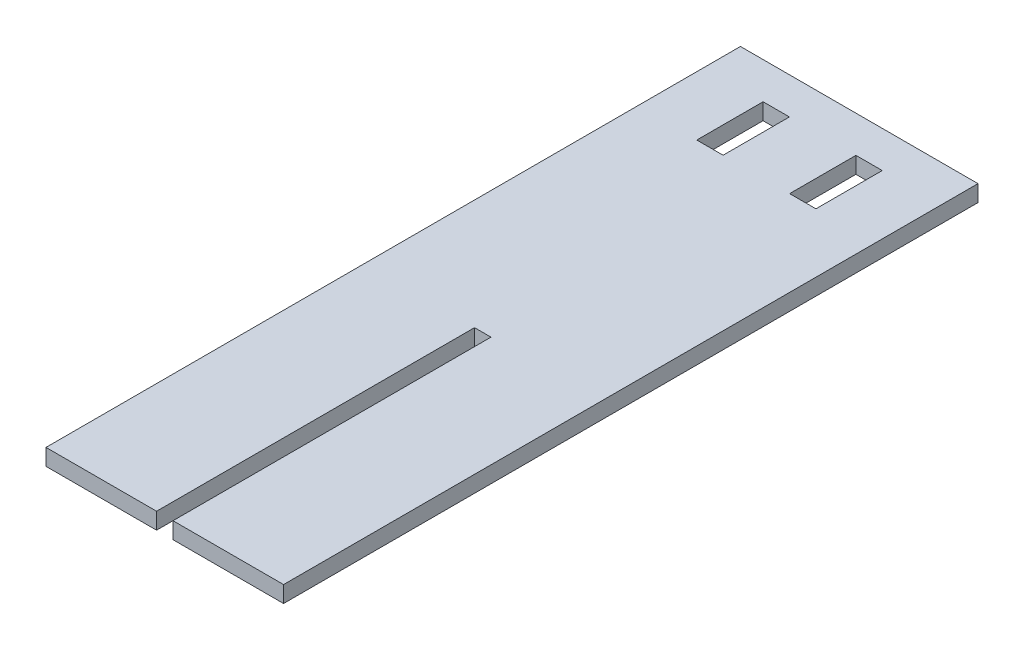
ISO-10303-21;
HEADER;
FILE_DESCRIPTION(('STEP AP214'),'2;1');
FILE_NAME('part.step','',(''),(''),'','','');
FILE_SCHEMA(('AUTOMOTIVE_DESIGN { 1 0 10303 214 1 1 1 1 }'));
ENDSEC;
DATA;
#1=APPLICATION_CONTEXT('core data for automotive mechanical design processes');
#2=APPLICATION_PROTOCOL_DEFINITION('international standard','automotive_design',2000,#1);
#3=PRODUCT_CONTEXT('',#1,'mechanical');
#4=PRODUCT('Part','Part','',(#3));
#5=PRODUCT_RELATED_PRODUCT_CATEGORY('part','',(#4));
#6=PRODUCT_DEFINITION_FORMATION('','',#4);
#7=PRODUCT_DEFINITION_CONTEXT('part definition',#1,'design');
#8=PRODUCT_DEFINITION('design','',#6,#7);
#9=PRODUCT_DEFINITION_SHAPE('','',#8);
#10=(LENGTH_UNIT() NAMED_UNIT(*) SI_UNIT(.MILLI.,.METRE.));
#11=(NAMED_UNIT(*) PLANE_ANGLE_UNIT() SI_UNIT($,.RADIAN.));
#12=(NAMED_UNIT(*) SI_UNIT($,.STERADIAN.) SOLID_ANGLE_UNIT());
#13=UNCERTAINTY_MEASURE_WITH_UNIT(LENGTH_MEASURE(1.E-05),#10,'distance_accuracy_value','');
#14=(GEOMETRIC_REPRESENTATION_CONTEXT(3) GLOBAL_UNCERTAINTY_ASSIGNED_CONTEXT((#13)) GLOBAL_UNIT_ASSIGNED_CONTEXT((#10,
#11,#12)) REPRESENTATION_CONTEXT('',''));
#15=CARTESIAN_POINT('',(0.,0.,0.));
#16=DIRECTION('',(0.,0.,1.));
#17=DIRECTION('',(1.,0.,0.));
#18=AXIS2_PLACEMENT_3D('',#15,#16,#17);
#19=CARTESIAN_POINT('',(-157.233042697884,5.715,-228.599999999999));
#20=DIRECTION('',(0.,0.,1.));
#21=DIRECTION('',(1.,0.,0.));
#22=AXIS2_PLACEMENT_3D('',#19,#20,#21);
#23=PLANE('',#22);
#24=DIRECTION('',(-1.,0.,0.));
#25=VECTOR('',#24,1.);
#26=CARTESIAN_POINT('',(-157.233042697884,0.,-228.599999999999));
#27=LINE('',#26,#25);
#28=CARTESIAN_POINT('',(29.718,0.,-228.6));
#29=VERTEX_POINT('',#28);
#30=CARTESIAN_POINT('',(20.574,0.,-228.6));
#31=VERTEX_POINT('',#30);
#32=EDGE_CURVE('E251',#29,#31,#27,.T.);
#33=ORIENTED_EDGE('',*,*,#32,.F.);
#34=DIRECTION('',(0.,-1.,0.));
#35=VECTOR('',#34,1.);
#36=CARTESIAN_POINT('',(29.718,5.715,-228.6));
#37=LINE('',#36,#35);
#38=CARTESIAN_POINT('',(29.718,5.715,-228.6));
#39=VERTEX_POINT('',#38);
#40=EDGE_CURVE('E11',#39,#29,#37,.T.);
#41=ORIENTED_EDGE('',*,*,#40,.F.);
#42=DIRECTION('',(-1.,0.,0.));
#43=VECTOR('',#42,1.);
#44=CARTESIAN_POINT('',(-157.233042697884,5.715,-228.599999999999));
#45=LINE('',#44,#43);
#46=CARTESIAN_POINT('',(20.574,5.715,-228.6));
#47=VERTEX_POINT('',#46);
#48=EDGE_CURVE('E168',#39,#47,#45,.T.);
#49=ORIENTED_EDGE('',*,*,#48,.T.);
#50=DIRECTION('',(0.,-1.,0.));
#51=VECTOR('',#50,1.);
#52=CARTESIAN_POINT('',(20.574,5.715,-228.6));
#53=LINE('',#52,#51);
#54=EDGE_CURVE('E54',#47,#31,#53,.T.);
#55=ORIENTED_EDGE('',*,*,#54,.T.);
#56=EDGE_LOOP('',(#33,#41,#49,#55));
#57=FACE_BOUND('',#56,.T.);
#58=ADVANCED_FACE('F35',(#57),#23,.T.);
#59=CARTESIAN_POINT('',(29.718,5.715,-120.65));
#60=DIRECTION('',(1.,0.,0.));
#61=DIRECTION('',(0.,0.,-1.));
#62=AXIS2_PLACEMENT_3D('',#59,#60,#61);
#63=PLANE('',#62);
#64=DIRECTION('',(0.,0.,1.));
#65=VECTOR('',#64,1.);
#66=CARTESIAN_POINT('',(29.718,0.,-120.65));
#67=LINE('',#66,#65);
#68=CARTESIAN_POINT('',(29.718,0.,-205.5622));
#69=VERTEX_POINT('',#68);
#70=EDGE_CURVE('E173',#29,#69,#67,.T.);
#71=ORIENTED_EDGE('',*,*,#70,.T.);
#72=DIRECTION('',(0.,-1.,0.));
#73=VECTOR('',#72,1.);
#74=CARTESIAN_POINT('',(29.718,5.715,-205.5622));
#75=LINE('',#74,#73);
#76=CARTESIAN_POINT('',(29.718,5.715,-205.5622));
#77=VERTEX_POINT('',#76);
#78=EDGE_CURVE('E45',#77,#69,#75,.T.);
#79=ORIENTED_EDGE('',*,*,#78,.F.);
#80=DIRECTION('',(0.,0.,1.));
#81=VECTOR('',#80,1.);
#82=CARTESIAN_POINT('',(29.718,5.715,-120.65));
#83=LINE('',#82,#81);
#84=EDGE_CURVE('E163',#39,#77,#83,.T.);
#85=ORIENTED_EDGE('',*,*,#84,.F.);
#86=ORIENTED_EDGE('',*,*,#40,.T.);
#87=EDGE_LOOP('',(#71,#79,#85,#86));
#88=FACE_BOUND('',#87,.T.);
#89=ADVANCED_FACE('F171',(#88),#63,.F.);
#90=CARTESIAN_POINT('',(-157.233042697883,5.715,-205.5622));
#91=DIRECTION('',(0.,0.,1.));
#92=DIRECTION('',(1.,0.,0.));
#93=AXIS2_PLACEMENT_3D('',#90,#91,#92);
#94=PLANE('',#93);
#95=DIRECTION('',(-1.,0.,0.));
#96=VECTOR('',#95,1.);
#97=CARTESIAN_POINT('',(-157.233042697883,0.,-205.5622));
#98=LINE('',#97,#96);
#99=CARTESIAN_POINT('',(20.574,0.,-205.5622));
#100=VERTEX_POINT('',#99);
#101=EDGE_CURVE('E254',#69,#100,#98,.T.);
#102=ORIENTED_EDGE('',*,*,#101,.T.);
#103=DIRECTION('',(0.,-1.,0.));
#104=VECTOR('',#103,1.);
#105=CARTESIAN_POINT('',(20.574,5.715,-205.5622));
#106=LINE('',#105,#104);
#107=CARTESIAN_POINT('',(20.574,5.715,-205.5622));
#108=VERTEX_POINT('',#107);
#109=EDGE_CURVE('E104',#108,#100,#106,.T.);
#110=ORIENTED_EDGE('',*,*,#109,.F.);
#111=DIRECTION('',(-1.,0.,0.));
#112=VECTOR('',#111,1.);
#113=CARTESIAN_POINT('',(-157.233042697883,5.715,-205.5622));
#114=LINE('',#113,#112);
#115=EDGE_CURVE('E155',#77,#108,#114,.T.);
#116=ORIENTED_EDGE('',*,*,#115,.F.);
#117=ORIENTED_EDGE('',*,*,#78,.T.);
#118=EDGE_LOOP('',(#102,#110,#116,#117));
#119=FACE_BOUND('',#118,.T.);
#120=ADVANCED_FACE('F157',(#119),#94,.F.);
#121=CARTESIAN_POINT('',(-157.233042697883,5.715,-228.600000000001));
#122=DIRECTION('',(0.,0.,-1.));
#123=DIRECTION('',(-1.,0.,0.));
#124=AXIS2_PLACEMENT_3D('',#121,#122,#123);
#125=PLANE('',#124);
#126=DIRECTION('',(1.,0.,0.));
#127=VECTOR('',#126,1.);
#128=CARTESIAN_POINT('',(-157.233042697883,0.,-228.600000000001));
#129=LINE('',#128,#127);
#130=CARTESIAN_POINT('',(52.832,0.,-228.6));
#131=VERTEX_POINT('',#130);
#132=CARTESIAN_POINT('',(61.976,0.,-228.6));
#133=VERTEX_POINT('',#132);
#134=EDGE_CURVE('E239',#131,#133,#129,.T.);
#135=ORIENTED_EDGE('',*,*,#134,.T.);
#136=DIRECTION('',(0.,-1.,0.));
#137=VECTOR('',#136,1.);
#138=CARTESIAN_POINT('',(61.976,5.715,-228.6));
#139=LINE('',#138,#137);
#140=CARTESIAN_POINT('',(61.976,5.715,-228.6));
#141=VERTEX_POINT('',#140);
#142=EDGE_CURVE('E184',#141,#133,#139,.T.);
#143=ORIENTED_EDGE('',*,*,#142,.F.);
#144=DIRECTION('',(1.,0.,0.));
#145=VECTOR('',#144,1.);
#146=CARTESIAN_POINT('',(-157.233042697883,5.715,-228.600000000001));
#147=LINE('',#146,#145);
#148=CARTESIAN_POINT('',(52.832,5.715,-228.6));
#149=VERTEX_POINT('',#148);
#150=EDGE_CURVE('E276',#149,#141,#147,.T.);
#151=ORIENTED_EDGE('',*,*,#150,.F.);
#152=DIRECTION('',(0.,-1.,0.));
#153=VECTOR('',#152,1.);
#154=CARTESIAN_POINT('',(52.832,5.715,-228.6));
#155=LINE('',#154,#153);
#156=EDGE_CURVE('E178',#149,#131,#155,.T.);
#157=ORIENTED_EDGE('',*,*,#156,.T.);
#158=EDGE_LOOP('',(#135,#143,#151,#157));
#159=FACE_BOUND('',#158,.T.);
#160=ADVANCED_FACE('F320',(#159),#125,.F.);
#161=CARTESIAN_POINT('',(61.976,5.715,-120.65));
#162=DIRECTION('',(1.,0.,0.));
#163=DIRECTION('',(0.,0.,-1.));
#164=AXIS2_PLACEMENT_3D('',#161,#162,#163);
#165=PLANE('',#164);
#166=DIRECTION('',(0.,0.,1.));
#167=VECTOR('',#166,1.);
#168=CARTESIAN_POINT('',(61.976,0.,-120.65));
#169=LINE('',#168,#167);
#170=CARTESIAN_POINT('',(61.976,0.,-205.5622));
#171=VERTEX_POINT('',#170);
#172=EDGE_CURVE('E242',#133,#171,#169,.T.);
#173=ORIENTED_EDGE('',*,*,#172,.T.);
#174=DIRECTION('',(0.,-1.,0.));
#175=VECTOR('',#174,1.);
#176=CARTESIAN_POINT('',(61.976,5.715,-205.5622));
#177=LINE('',#176,#175);
#178=CARTESIAN_POINT('',(61.976,5.715,-205.5622));
#179=VERTEX_POINT('',#178);
#180=EDGE_CURVE('E182',#179,#171,#177,.T.);
#181=ORIENTED_EDGE('',*,*,#180,.F.);
#182=DIRECTION('',(0.,0.,1.));
#183=VECTOR('',#182,1.);
#184=CARTESIAN_POINT('',(61.976,5.715,-120.65));
#185=LINE('',#184,#183);
#186=EDGE_CURVE('E279',#141,#179,#185,.T.);
#187=ORIENTED_EDGE('',*,*,#186,.F.);
#188=ORIENTED_EDGE('',*,*,#142,.T.);
#189=EDGE_LOOP('',(#173,#181,#187,#188));
#190=FACE_BOUND('',#189,.T.);
#191=ADVANCED_FACE('F316',(#190),#165,.F.);
#192=CARTESIAN_POINT('',(-157.233042697883,5.715,-205.5622));
#193=DIRECTION('',(0.,0.,-1.));
#194=DIRECTION('',(-1.,0.,0.));
#195=AXIS2_PLACEMENT_3D('',#192,#193,#194);
#196=PLANE('',#195);
#197=DIRECTION('',(1.,0.,0.));
#198=VECTOR('',#197,1.);
#199=CARTESIAN_POINT('',(-157.233042697883,0.,-205.5622));
#200=LINE('',#199,#198);
#201=CARTESIAN_POINT('',(52.832,0.,-205.5622));
#202=VERTEX_POINT('',#201);
#203=EDGE_CURVE('E245',#202,#171,#200,.T.);
#204=ORIENTED_EDGE('',*,*,#203,.F.);
#205=DIRECTION('',(0.,-1.,0.));
#206=VECTOR('',#205,1.);
#207=CARTESIAN_POINT('',(52.832,5.715,-205.5622));
#208=LINE('',#207,#206);
#209=CARTESIAN_POINT('',(52.832,5.715,-205.5622));
#210=VERTEX_POINT('',#209);
#211=EDGE_CURVE('E180',#210,#202,#208,.T.);
#212=ORIENTED_EDGE('',*,*,#211,.F.);
#213=DIRECTION('',(1.,0.,0.));
#214=VECTOR('',#213,1.);
#215=CARTESIAN_POINT('',(-157.233042697883,5.715,-205.5622));
#216=LINE('',#215,#214);
#217=EDGE_CURVE('E281',#210,#179,#216,.T.);
#218=ORIENTED_EDGE('',*,*,#217,.T.);
#219=ORIENTED_EDGE('',*,*,#180,.T.);
#220=EDGE_LOOP('',(#204,#212,#218,#219));
#221=FACE_BOUND('',#220,.T.);
#222=ADVANCED_FACE('F313',(#221),#196,.T.);
#223=CARTESIAN_POINT('',(-157.233042697883,5.715,-241.3));
#224=DIRECTION('',(0.,0.,-1.));
#225=DIRECTION('',(-1.,0.,0.));
#226=AXIS2_PLACEMENT_3D('',#223,#224,#225);
#227=PLANE('',#226);
#228=DIRECTION('',(1.,0.,0.));
#229=VECTOR('',#228,1.);
#230=CARTESIAN_POINT('',(-157.233042697883,0.,-241.3));
#231=LINE('',#230,#229);
#232=CARTESIAN_POINT('',(0.,0.,-241.3));
#233=VERTEX_POINT('',#232);
#234=CARTESIAN_POINT('',(82.55,0.,-241.3));
#235=VERTEX_POINT('',#234);
#236=EDGE_CURVE('E215',#233,#235,#231,.T.);
#237=ORIENTED_EDGE('',*,*,#236,.F.);
#238=DIRECTION('',(0.,-1.,0.));
#239=VECTOR('',#238,1.);
#240=CARTESIAN_POINT('',(0.,5.715,-241.3));
#241=LINE('',#240,#239);
#242=CARTESIAN_POINT('',(0.,5.715,-241.3));
#243=VERTEX_POINT('',#242);
#244=EDGE_CURVE('E39',#243,#233,#241,.T.);
#245=ORIENTED_EDGE('',*,*,#244,.F.);
#246=DIRECTION('',(1.,0.,0.));
#247=VECTOR('',#246,1.);
#248=CARTESIAN_POINT('',(-157.233042697883,5.715,-241.3));
#249=LINE('',#248,#247);
#250=CARTESIAN_POINT('',(82.55,5.715,-241.3));
#251=VERTEX_POINT('',#250);
#252=EDGE_CURVE('E258',#243,#251,#249,.T.);
#253=ORIENTED_EDGE('',*,*,#252,.T.);
#254=DIRECTION('',(0.,-1.,0.));
#255=VECTOR('',#254,1.);
#256=CARTESIAN_POINT('',(82.55,5.715,-241.3));
#257=LINE('',#256,#255);
#258=EDGE_CURVE('E187',#251,#235,#257,.T.);
#259=ORIENTED_EDGE('',*,*,#258,.T.);
#260=EDGE_LOOP('',(#237,#245,#253,#259));
#261=FACE_BOUND('',#260,.T.);
#262=ADVANCED_FACE('F37',(#261),#227,.T.);
#263=CARTESIAN_POINT('',(0.,5.715,-120.65));
#264=DIRECTION('',(-1.,0.,0.));
#265=DIRECTION('',(0.,0.,1.));
#266=AXIS2_PLACEMENT_3D('',#263,#264,#265);
#267=PLANE('',#266);
#268=DIRECTION('',(0.,0.,-1.));
#269=VECTOR('',#268,1.);
#270=CARTESIAN_POINT('',(0.,0.,-120.65));
#271=LINE('',#270,#269);
#272=CARTESIAN_POINT('',(0.,0.,0.));
#273=VERTEX_POINT('',#272);
#274=EDGE_CURVE('E211',#273,#233,#271,.T.);
#275=ORIENTED_EDGE('',*,*,#274,.F.);
#276=DIRECTION('',(0.,-1.,0.));
#277=VECTOR('',#276,1.);
#278=CARTESIAN_POINT('',(0.,5.715,0.));
#279=LINE('',#278,#277);
#280=CARTESIAN_POINT('',(0.,5.715,0.));
#281=VERTEX_POINT('',#280);
#282=EDGE_CURVE('E201',#281,#273,#279,.T.);
#283=ORIENTED_EDGE('',*,*,#282,.F.);
#284=DIRECTION('',(0.,0.,-1.));
#285=VECTOR('',#284,1.);
#286=CARTESIAN_POINT('',(0.,5.715,-120.65));
#287=LINE('',#286,#285);
#288=EDGE_CURVE('E213',#281,#243,#287,.T.);
#289=ORIENTED_EDGE('',*,*,#288,.T.);
#290=ORIENTED_EDGE('',*,*,#244,.T.);
#291=EDGE_LOOP('',(#275,#283,#289,#290));
#292=FACE_BOUND('',#291,.T.);
#293=ADVANCED_FACE('F209',(#292),#267,.T.);
#294=CARTESIAN_POINT('',(-157.233042697883,5.715,0.));
#295=DIRECTION('',(0.,0.,-1.));
#296=DIRECTION('',(-1.,0.,0.));
#297=AXIS2_PLACEMENT_3D('',#294,#295,#296);
#298=PLANE('',#297);
#299=DIRECTION('',(1.,0.,0.));
#300=VECTOR('',#299,1.);
#301=CARTESIAN_POINT('',(-157.233042697883,0.,0.));
#302=LINE('',#301,#300);
#303=CARTESIAN_POINT('',(38.4175,0.,0.));
#304=VERTEX_POINT('',#303);
#305=EDGE_CURVE('E224',#273,#304,#302,.T.);
#306=ORIENTED_EDGE('',*,*,#305,.T.);
#307=DIRECTION('',(0.,-1.,0.));
#308=VECTOR('',#307,1.);
#309=CARTESIAN_POINT('',(38.4175,5.715,0.));
#310=LINE('',#309,#308);
#311=CARTESIAN_POINT('',(38.4175,5.715,0.));
#312=VERTEX_POINT('',#311);
#313=EDGE_CURVE('E200',#312,#304,#310,.T.);
#314=ORIENTED_EDGE('',*,*,#313,.F.);
#315=DIRECTION('',(1.,0.,0.));
#316=VECTOR('',#315,1.);
#317=CARTESIAN_POINT('',(-157.233042697883,5.715,0.));
#318=LINE('',#317,#316);
#319=EDGE_CURVE('E261',#281,#312,#318,.T.);
#320=ORIENTED_EDGE('',*,*,#319,.F.);
#321=ORIENTED_EDGE('',*,*,#282,.T.);
#322=EDGE_LOOP('',(#306,#314,#320,#321));
#323=FACE_BOUND('',#322,.T.);
#324=ADVANCED_FACE('F339',(#323),#298,.F.);
#325=CARTESIAN_POINT('',(38.4175,5.715,-120.65));
#326=DIRECTION('',(1.,0.,0.));
#327=DIRECTION('',(0.,0.,-1.));
#328=AXIS2_PLACEMENT_3D('',#325,#326,#327);
#329=PLANE('',#328);
#330=DIRECTION('',(0.,0.,1.));
#331=VECTOR('',#330,1.);
#332=CARTESIAN_POINT('',(38.4175,0.,-120.65));
#333=LINE('',#332,#331);
#334=CARTESIAN_POINT('',(38.4175,0.,-110.49));
#335=VERTEX_POINT('',#334);
#336=EDGE_CURVE('E226',#335,#304,#333,.T.);
#337=ORIENTED_EDGE('',*,*,#336,.F.);
#338=DIRECTION('',(0.,-1.,0.));
#339=VECTOR('',#338,1.);
#340=CARTESIAN_POINT('',(38.4175,5.715,-110.49));
#341=LINE('',#340,#339);
#342=CARTESIAN_POINT('',(38.4175,5.715,-110.49));
#343=VERTEX_POINT('',#342);
#344=EDGE_CURVE('E198',#343,#335,#341,.T.);
#345=ORIENTED_EDGE('',*,*,#344,.F.);
#346=DIRECTION('',(0.,0.,1.));
#347=VECTOR('',#346,1.);
#348=CARTESIAN_POINT('',(38.4175,5.715,-120.65));
#349=LINE('',#348,#347);
#350=EDGE_CURVE('E265',#343,#312,#349,.T.);
#351=ORIENTED_EDGE('',*,*,#350,.T.);
#352=ORIENTED_EDGE('',*,*,#313,.T.);
#353=EDGE_LOOP('',(#337,#345,#351,#352));
#354=FACE_BOUND('',#353,.T.);
#355=ADVANCED_FACE('F335',(#354),#329,.T.);
#356=CARTESIAN_POINT('',(-157.233042697883,5.715,-110.49));
#357=DIRECTION('',(0.,0.,-1.));
#358=DIRECTION('',(-1.,0.,0.));
#359=AXIS2_PLACEMENT_3D('',#356,#357,#358);
#360=PLANE('',#359);
#361=DIRECTION('',(1.,0.,0.));
#362=VECTOR('',#361,1.);
#363=CARTESIAN_POINT('',(-157.233042697883,0.,-110.49));
#364=LINE('',#363,#362);
#365=CARTESIAN_POINT('',(44.1325,0.,-110.49));
#366=VERTEX_POINT('',#365);
#367=EDGE_CURVE('E231',#335,#366,#364,.T.);
#368=ORIENTED_EDGE('',*,*,#367,.T.);
#369=DIRECTION('',(0.,-1.,0.));
#370=VECTOR('',#369,1.);
#371=CARTESIAN_POINT('',(44.1325,5.715,-110.49));
#372=LINE('',#371,#370);
#373=CARTESIAN_POINT('',(44.1325,5.715,-110.49));
#374=VERTEX_POINT('',#373);
#375=EDGE_CURVE('E195',#374,#366,#372,.T.);
#376=ORIENTED_EDGE('',*,*,#375,.F.);
#377=DIRECTION('',(1.,0.,0.));
#378=VECTOR('',#377,1.);
#379=CARTESIAN_POINT('',(-157.233042697883,5.715,-110.49));
#380=LINE('',#379,#378);
#381=EDGE_CURVE('E268',#343,#374,#380,.T.);
#382=ORIENTED_EDGE('',*,*,#381,.F.);
#383=ORIENTED_EDGE('',*,*,#344,.T.);
#384=EDGE_LOOP('',(#368,#376,#382,#383));
#385=FACE_BOUND('',#384,.T.);
#386=ADVANCED_FACE('F331',(#385),#360,.F.);
#387=CARTESIAN_POINT('',(44.1325,5.715,-120.65));
#388=DIRECTION('',(1.,0.,0.));
#389=DIRECTION('',(0.,0.,-1.));
#390=AXIS2_PLACEMENT_3D('',#387,#388,#389);
#391=PLANE('',#390);
#392=DIRECTION('',(0.,0.,1.));
#393=VECTOR('',#392,1.);
#394=CARTESIAN_POINT('',(44.1325,0.,-120.65));
#395=LINE('',#394,#393);
#396=CARTESIAN_POINT('',(44.1325,0.,0.));
#397=VERTEX_POINT('',#396);
#398=EDGE_CURVE('E233',#366,#397,#395,.T.);
#399=ORIENTED_EDGE('',*,*,#398,.T.);
#400=DIRECTION('',(0.,-1.,0.));
#401=VECTOR('',#400,1.);
#402=CARTESIAN_POINT('',(44.1325,5.715,0.));
#403=LINE('',#402,#401);
#404=CARTESIAN_POINT('',(44.1325,5.715,0.));
#405=VERTEX_POINT('',#404);
#406=EDGE_CURVE('E192',#405,#397,#403,.T.);
#407=ORIENTED_EDGE('',*,*,#406,.F.);
#408=DIRECTION('',(0.,0.,1.));
#409=VECTOR('',#408,1.);
#410=CARTESIAN_POINT('',(44.1325,5.715,-120.65));
#411=LINE('',#410,#409);
#412=EDGE_CURVE('E270',#374,#405,#411,.T.);
#413=ORIENTED_EDGE('',*,*,#412,.F.);
#414=ORIENTED_EDGE('',*,*,#375,.T.);
#415=EDGE_LOOP('',(#399,#407,#413,#414));
#416=FACE_BOUND('',#415,.T.);
#417=ADVANCED_FACE('F327',(#416),#391,.F.);
#418=CARTESIAN_POINT('',(-157.233042697883,5.715,0.));
#419=DIRECTION('',(0.,0.,-1.));
#420=DIRECTION('',(-1.,0.,0.));
#421=AXIS2_PLACEMENT_3D('',#418,#419,#420);
#422=PLANE('',#421);
#423=DIRECTION('',(1.,0.,0.));
#424=VECTOR('',#423,1.);
#425=CARTESIAN_POINT('',(-157.233042697883,0.,0.));
#426=LINE('',#425,#424);
#427=CARTESIAN_POINT('',(82.55,0.,0.));
#428=VERTEX_POINT('',#427);
#429=EDGE_CURVE('E235',#397,#428,#426,.T.);
#430=ORIENTED_EDGE('',*,*,#429,.T.);
#431=DIRECTION('',(0.,-1.,0.));
#432=VECTOR('',#431,1.);
#433=CARTESIAN_POINT('',(82.55,5.715,0.));
#434=LINE('',#433,#432);
#435=CARTESIAN_POINT('',(82.55,5.715,0.));
#436=VERTEX_POINT('',#435);
#437=EDGE_CURVE('E189',#436,#428,#434,.T.);
#438=ORIENTED_EDGE('',*,*,#437,.F.);
#439=DIRECTION('',(1.,0.,0.));
#440=VECTOR('',#439,1.);
#441=CARTESIAN_POINT('',(-157.233042697883,5.715,0.));
#442=LINE('',#441,#440);
#443=EDGE_CURVE('E272',#405,#436,#442,.T.);
#444=ORIENTED_EDGE('',*,*,#443,.F.);
#445=ORIENTED_EDGE('',*,*,#406,.T.);
#446=EDGE_LOOP('',(#430,#438,#444,#445));
#447=FACE_BOUND('',#446,.T.);
#448=ADVANCED_FACE('F311',(#447),#422,.F.);
#449=CARTESIAN_POINT('',(52.832,5.715,-120.65));
#450=DIRECTION('',(1.,0.,0.));
#451=DIRECTION('',(0.,0.,-1.));
#452=AXIS2_PLACEMENT_3D('',#449,#450,#451);
#453=PLANE('',#452);
#454=DIRECTION('',(0.,0.,1.));
#455=VECTOR('',#454,1.);
#456=CARTESIAN_POINT('',(52.832,0.,-120.65));
#457=LINE('',#456,#455);
#458=EDGE_CURVE('E248',#131,#202,#457,.T.);
#459=ORIENTED_EDGE('',*,*,#458,.F.);
#460=ORIENTED_EDGE('',*,*,#156,.F.);
#461=DIRECTION('',(0.,0.,1.));
#462=VECTOR('',#461,1.);
#463=CARTESIAN_POINT('',(52.832,5.715,-120.65));
#464=LINE('',#463,#462);
#465=EDGE_CURVE('E284',#149,#210,#464,.T.);
#466=ORIENTED_EDGE('',*,*,#465,.T.);
#467=ORIENTED_EDGE('',*,*,#211,.T.);
#468=EDGE_LOOP('',(#459,#460,#466,#467));
#469=FACE_BOUND('',#468,.T.);
#470=ADVANCED_FACE('F297',(#469),#453,.T.);
#471=CARTESIAN_POINT('',(82.55,5.715,-120.65));
#472=DIRECTION('',(-1.,0.,0.));
#473=DIRECTION('',(0.,0.,1.));
#474=AXIS2_PLACEMENT_3D('',#471,#472,#473);
#475=PLANE('',#474);
#476=DIRECTION('',(0.,0.,-1.));
#477=VECTOR('',#476,1.);
#478=CARTESIAN_POINT('',(82.55,0.,-120.65));
#479=LINE('',#478,#477);
#480=EDGE_CURVE('E237',#428,#235,#479,.T.);
#481=ORIENTED_EDGE('',*,*,#480,.T.);
#482=ORIENTED_EDGE('',*,*,#258,.F.);
#483=DIRECTION('',(0.,0.,-1.));
#484=VECTOR('',#483,1.);
#485=CARTESIAN_POINT('',(82.55,5.715,-120.65));
#486=LINE('',#485,#484);
#487=EDGE_CURVE('E274',#436,#251,#486,.T.);
#488=ORIENTED_EDGE('',*,*,#487,.F.);
#489=ORIENTED_EDGE('',*,*,#437,.T.);
#490=EDGE_LOOP('',(#481,#482,#488,#489));
#491=FACE_BOUND('',#490,.T.);
#492=ADVANCED_FACE('F289',(#491),#475,.F.);
#493=CARTESIAN_POINT('',(20.574,5.715,-120.65));
#494=DIRECTION('',(1.,0.,0.));
#495=DIRECTION('',(0.,0.,-1.));
#496=AXIS2_PLACEMENT_3D('',#493,#494,#495);
#497=PLANE('',#496);
#498=DIRECTION('',(0.,0.,1.));
#499=VECTOR('',#498,1.);
#500=CARTESIAN_POINT('',(20.574,0.,-120.65));
#501=LINE('',#500,#499);
#502=EDGE_CURVE('E256',#31,#100,#501,.T.);
#503=ORIENTED_EDGE('',*,*,#502,.F.);
#504=ORIENTED_EDGE('',*,*,#54,.F.);
#505=DIRECTION('',(0.,0.,1.));
#506=VECTOR('',#505,1.);
#507=CARTESIAN_POINT('',(20.574,5.715,-120.65));
#508=LINE('',#507,#506);
#509=EDGE_CURVE('E162',#47,#108,#508,.T.);
#510=ORIENTED_EDGE('',*,*,#509,.T.);
#511=ORIENTED_EDGE('',*,*,#109,.T.);
#512=EDGE_LOOP('',(#503,#504,#510,#511));
#513=FACE_BOUND('',#512,.T.);
#514=ADVANCED_FACE('F287',(#513),#497,.T.);
#515=CARTESIAN_POINT('',(-157.233042697883,5.715,-120.65));
#516=DIRECTION('',(0.,1.,0.));
#517=DIRECTION('',(0.,0.,1.));
#518=AXIS2_PLACEMENT_3D('',#515,#516,#517);
#519=PLANE('',#518);
#520=ORIENTED_EDGE('',*,*,#252,.F.);
#521=ORIENTED_EDGE('',*,*,#288,.F.);
#522=ORIENTED_EDGE('',*,*,#319,.T.);
#523=ORIENTED_EDGE('',*,*,#350,.F.);
#524=ORIENTED_EDGE('',*,*,#381,.T.);
#525=ORIENTED_EDGE('',*,*,#412,.T.);
#526=ORIENTED_EDGE('',*,*,#443,.T.);
#527=ORIENTED_EDGE('',*,*,#487,.T.);
#528=EDGE_LOOP('',(#520,#521,#522,#523,#524,#525,#526,#527));
#529=FACE_BOUND('',#528,.T.);
#530=ORIENTED_EDGE('',*,*,#150,.T.);
#531=ORIENTED_EDGE('',*,*,#186,.T.);
#532=ORIENTED_EDGE('',*,*,#217,.F.);
#533=ORIENTED_EDGE('',*,*,#465,.F.);
#534=EDGE_LOOP('',(#530,#531,#532,#533));
#535=FACE_BOUND('',#534,.T.);
#536=ORIENTED_EDGE('',*,*,#48,.F.);
#537=ORIENTED_EDGE('',*,*,#84,.T.);
#538=ORIENTED_EDGE('',*,*,#115,.T.);
#539=ORIENTED_EDGE('',*,*,#509,.F.);
#540=EDGE_LOOP('',(#536,#537,#538,#539));
#541=FACE_BOUND('',#540,.T.);
#542=ADVANCED_FACE('F167',(#529,#535,#541),#519,.T.);
#543=CARTESIAN_POINT('',(-157.233042697883,0.,-120.65));
#544=DIRECTION('',(0.,1.,0.));
#545=DIRECTION('',(0.,0.,1.));
#546=AXIS2_PLACEMENT_3D('',#543,#544,#545);
#547=PLANE('',#546);
#548=ORIENTED_EDGE('',*,*,#236,.T.);
#549=ORIENTED_EDGE('',*,*,#480,.F.);
#550=ORIENTED_EDGE('',*,*,#429,.F.);
#551=ORIENTED_EDGE('',*,*,#398,.F.);
#552=ORIENTED_EDGE('',*,*,#367,.F.);
#553=ORIENTED_EDGE('',*,*,#336,.T.);
#554=ORIENTED_EDGE('',*,*,#305,.F.);
#555=ORIENTED_EDGE('',*,*,#274,.T.);
#556=EDGE_LOOP('',(#548,#549,#550,#551,#552,#553,#554,#555));
#557=FACE_BOUND('',#556,.T.);
#558=ORIENTED_EDGE('',*,*,#134,.F.);
#559=ORIENTED_EDGE('',*,*,#458,.T.);
#560=ORIENTED_EDGE('',*,*,#203,.T.);
#561=ORIENTED_EDGE('',*,*,#172,.F.);
#562=EDGE_LOOP('',(#558,#559,#560,#561));
#563=FACE_BOUND('',#562,.T.);
#564=ORIENTED_EDGE('',*,*,#32,.T.);
#565=ORIENTED_EDGE('',*,*,#502,.T.);
#566=ORIENTED_EDGE('',*,*,#101,.F.);
#567=ORIENTED_EDGE('',*,*,#70,.F.);
#568=EDGE_LOOP('',(#564,#565,#566,#567));
#569=FACE_BOUND('',#568,.T.);
#570=ADVANCED_FACE('F221',(#557,#563,#569),#547,.F.);
#571=CLOSED_SHELL('',(#58,#89,#120,#160,#191,#222,#262,#293,#324,#355,#386,#417,#448,#470,#492,
#514,#542,#570));
#572=MANIFOLD_SOLID_BREP('B2',#571);
#573=ADVANCED_BREP_SHAPE_REPRESENTATION('',(#18,#572),#14);
#574=SHAPE_DEFINITION_REPRESENTATION(#9,#573);
ENDSEC;
END-ISO-10303-21;
